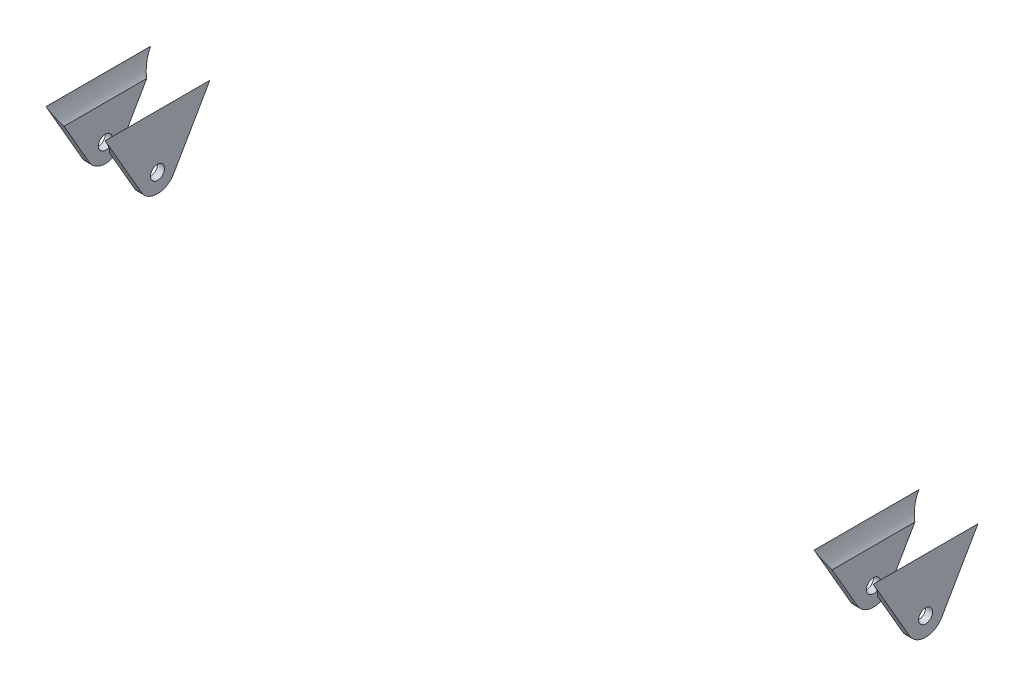
ISO-10303-21;
HEADER;
FILE_DESCRIPTION(('STEP AP214'),'2;1');
FILE_NAME('part.step','',(''),(''),'','','');
FILE_SCHEMA(('AUTOMOTIVE_DESIGN { 1 0 10303 214 1 1 1 1 }'));
ENDSEC;
DATA;
#1=APPLICATION_CONTEXT('core data for automotive mechanical design processes');
#2=APPLICATION_PROTOCOL_DEFINITION('international standard','automotive_design',2000,#1);
#3=PRODUCT_CONTEXT('',#1,'mechanical');
#4=PRODUCT('Part','Part','',(#3));
#5=PRODUCT_RELATED_PRODUCT_CATEGORY('part','',(#4));
#6=PRODUCT_DEFINITION_FORMATION('','',#4);
#7=PRODUCT_DEFINITION_CONTEXT('part definition',#1,'design');
#8=PRODUCT_DEFINITION('design','',#6,#7);
#9=PRODUCT_DEFINITION_SHAPE('','',#8);
#10=(LENGTH_UNIT() NAMED_UNIT(*) SI_UNIT(.MILLI.,.METRE.));
#11=(NAMED_UNIT(*) PLANE_ANGLE_UNIT() SI_UNIT($,.RADIAN.));
#12=(NAMED_UNIT(*) SI_UNIT($,.STERADIAN.) SOLID_ANGLE_UNIT());
#13=UNCERTAINTY_MEASURE_WITH_UNIT(LENGTH_MEASURE(1.E-05),#10,'distance_accuracy_value','');
#14=(GEOMETRIC_REPRESENTATION_CONTEXT(3) GLOBAL_UNCERTAINTY_ASSIGNED_CONTEXT((#13)) GLOBAL_UNIT_ASSIGNED_CONTEXT((#10,
#11,#12)) REPRESENTATION_CONTEXT('',''));
#15=CARTESIAN_POINT('',(0.,0.,0.));
#16=DIRECTION('',(0.,0.,1.));
#17=DIRECTION('',(1.,0.,0.));
#18=AXIS2_PLACEMENT_3D('',#15,#16,#17);
#19=CARTESIAN_POINT('',(-155.299999999999,-5.59119222334012E-13,0.));
#20=DIRECTION('',(-1.,0.,0.));
#21=DIRECTION('',(0.,1.,0.));
#22=AXIS2_PLACEMENT_3D('',#19,#20,#21);
#23=PLANE('',#22);
#24=CARTESIAN_POINT('',(-155.3,177.,222.5));
#25=DIRECTION('',(1.,0.,0.));
#26=DIRECTION('',(0.,0.,-1.));
#27=AXIS2_PLACEMENT_3D('',#24,#25,#26);
#28=CIRCLE('',#27,2.99999999999999);
#29=CARTESIAN_POINT('',(-155.3,177.,219.5));
#30=VERTEX_POINT('',#29);
#31=EDGE_CURVE('E13',#30,#30,#28,.T.);
#32=ORIENTED_EDGE('',*,*,#31,.T.);
#33=EDGE_LOOP('',(#32));
#34=FACE_BOUND('',#33,.T.);
#35=DIRECTION('',(0.,0.866256782365015,-0.499599026226644));
#36=VECTOR('',#35,1.);
#37=CARTESIAN_POINT('',(-155.3,173.003207790187,215.56994574108));
#38=LINE('',#37,#36);
#39=CARTESIAN_POINT('',(-155.3,173.003207790187,215.56994574108));
#40=VERTEX_POINT('',#39);
#41=CARTESIAN_POINT('',(-155.3,191.802439387232,204.727805176187));
#42=VERTEX_POINT('',#41);
#43=EDGE_CURVE('E135',#40,#42,#38,.T.);
#44=ORIENTED_EDGE('',*,*,#43,.F.);
#45=CARTESIAN_POINT('',(-155.3,177.,222.5));
#46=DIRECTION('',(1.,0.,0.));
#47=DIRECTION('',(0.,0.,-1.));
#48=AXIS2_PLACEMENT_3D('',#45,#46,#47);
#49=CIRCLE('',#48,7.99999999999999);
#50=CARTESIAN_POINT('',(-155.3,173.003207790187,229.43005425892));
#51=VERTEX_POINT('',#50);
#52=EDGE_CURVE('E152',#51,#40,#49,.T.);
#53=ORIENTED_EDGE('',*,*,#52,.F.);
#54=DIRECTION('',(0.,-0.866256782365014,-0.499599026226646));
#55=VECTOR('',#54,1.);
#56=CARTESIAN_POINT('',(-155.3,200.,245.));
#57=LINE('',#56,#55);
#58=CARTESIAN_POINT('',(-155.3,191.802439387233,240.272194823813));
#59=VERTEX_POINT('',#58);
#60=EDGE_CURVE('E165',#59,#51,#57,.T.);
#61=ORIENTED_EDGE('',*,*,#60,.F.);
#62=DIRECTION('',(0.,0.,1.));
#63=VECTOR('',#62,1.);
#64=CARTESIAN_POINT('',(-155.3,191.802439387233,1.18021414993795E-10));
#65=LINE('',#64,#63);
#66=EDGE_CURVE('E164',#42,#59,#65,.T.);
#67=ORIENTED_EDGE('',*,*,#66,.F.);
#68=EDGE_LOOP('',(#44,#53,#61,#67));
#69=FACE_BOUND('',#68,.T.);
#70=ADVANCED_FACE('F88',(#34,#69),#23,.T.);
#71=CARTESIAN_POINT('',(-152.299999999999,-5.59119222334012E-13,0.));
#72=DIRECTION('',(-1.,0.,0.));
#73=DIRECTION('',(0.,1.,0.));
#74=AXIS2_PLACEMENT_3D('',#71,#72,#73);
#75=PLANE('',#74);
#76=CARTESIAN_POINT('',(-152.3,177.,222.5));
#77=DIRECTION('',(1.,0.,0.));
#78=DIRECTION('',(0.,0.,-1.));
#79=AXIS2_PLACEMENT_3D('',#76,#77,#78);
#80=CIRCLE('',#79,2.99999999999999);
#81=CARTESIAN_POINT('',(-152.3,177.,219.5));
#82=VERTEX_POINT('',#81);
#83=EDGE_CURVE('E147',#82,#82,#80,.T.);
#84=ORIENTED_EDGE('',*,*,#83,.F.);
#85=EDGE_LOOP('',(#84));
#86=FACE_BOUND('',#85,.T.);
#87=DIRECTION('',(0.,0.,-1.));
#88=VECTOR('',#87,1.);
#89=CARTESIAN_POINT('',(-152.3,200.,245.));
#90=LINE('',#89,#88);
#91=CARTESIAN_POINT('',(-152.3,200.,245.));
#92=VERTEX_POINT('',#91);
#93=CARTESIAN_POINT('',(-152.3,200.,200.));
#94=VERTEX_POINT('',#93);
#95=EDGE_CURVE('E141',#92,#94,#90,.T.);
#96=ORIENTED_EDGE('',*,*,#95,.F.);
#97=DIRECTION('',(0.,-0.866256782365014,-0.499599026226646));
#98=VECTOR('',#97,1.);
#99=CARTESIAN_POINT('',(-152.3,200.,245.));
#100=LINE('',#99,#98);
#101=CARTESIAN_POINT('',(-152.3,173.003207790187,229.43005425892));
#102=VERTEX_POINT('',#101);
#103=EDGE_CURVE('E149',#92,#102,#100,.T.);
#104=ORIENTED_EDGE('',*,*,#103,.T.);
#105=CARTESIAN_POINT('',(-152.3,177.,222.5));
#106=DIRECTION('',(1.,0.,0.));
#107=DIRECTION('',(0.,0.,-1.));
#108=AXIS2_PLACEMENT_3D('',#105,#106,#107);
#109=CIRCLE('',#108,7.99999999999999);
#110=CARTESIAN_POINT('',(-152.3,173.003207790187,215.56994574108));
#111=VERTEX_POINT('',#110);
#112=EDGE_CURVE('E143',#102,#111,#109,.T.);
#113=ORIENTED_EDGE('',*,*,#112,.T.);
#114=DIRECTION('',(0.,0.866256782365015,-0.499599026226644));
#115=VECTOR('',#114,1.);
#116=CARTESIAN_POINT('',(-152.3,173.003207790187,215.56994574108));
#117=LINE('',#116,#115);
#118=EDGE_CURVE('E132',#111,#94,#117,.T.);
#119=ORIENTED_EDGE('',*,*,#118,.T.);
#120=EDGE_LOOP('',(#96,#104,#113,#119));
#121=FACE_BOUND('',#120,.T.);
#122=ADVANCED_FACE('F139',(#86,#121),#75,.F.);
#123=CARTESIAN_POINT('',(-152.3,200.,245.));
#124=DIRECTION('',(0.,-0.499599026226646,0.866256782365014));
#125=DIRECTION('',(0.,-0.866256782365014,-0.499599026226646));
#126=AXIS2_PLACEMENT_3D('',#123,#124,#125);
#127=PLANE('',#126);
#128=ORIENTED_EDGE('',*,*,#60,.T.);
#129=DIRECTION('',(-1.,0.,0.));
#130=VECTOR('',#129,1.);
#131=CARTESIAN_POINT('',(-152.3,173.003207790187,229.43005425892));
#132=LINE('',#131,#130);
#133=EDGE_CURVE('E160',#102,#51,#132,.T.);
#134=ORIENTED_EDGE('',*,*,#133,.F.);
#135=ORIENTED_EDGE('',*,*,#103,.F.);
#136=CARTESIAN_POINT('',(-165.,200.,245.));
#137=DIRECTION('',(0.,0.499599026226646,-0.866256782365014));
#138=DIRECTION('',(0.,0.866256782365014,0.499599026226646));
#139=AXIS2_PLACEMENT_3D('',#136,#137,#138);
#140=ELLIPSE('',#139,14.6607798732924,12.7);
#141=EDGE_CURVE('E106',#59,#92,#140,.F.);
#142=ORIENTED_EDGE('',*,*,#141,.F.);
#143=EDGE_LOOP('',(#128,#134,#135,#142));
#144=FACE_BOUND('',#143,.T.);
#145=ADVANCED_FACE('F189',(#144),#127,.T.);
#146=CARTESIAN_POINT('',(-152.3,177.,222.5));
#147=DIRECTION('',(-1.,0.,0.));
#148=DIRECTION('',(0.,0.,-1.));
#149=AXIS2_PLACEMENT_3D('',#146,#147,#148);
#150=CYLINDRICAL_SURFACE('',#149,7.99999999999999);
#151=ORIENTED_EDGE('',*,*,#52,.T.);
#152=DIRECTION('',(-1.,0.,0.));
#153=VECTOR('',#152,1.);
#154=CARTESIAN_POINT('',(-152.3,173.003207790187,215.56994574108));
#155=LINE('',#154,#153);
#156=EDGE_CURVE('E144',#111,#40,#155,.T.);
#157=ORIENTED_EDGE('',*,*,#156,.F.);
#158=ORIENTED_EDGE('',*,*,#112,.F.);
#159=ORIENTED_EDGE('',*,*,#133,.T.);
#160=EDGE_LOOP('',(#151,#157,#158,#159));
#161=FACE_BOUND('',#160,.T.);
#162=ADVANCED_FACE('F186',(#161),#150,.T.);
#163=CARTESIAN_POINT('',(-152.3,173.003207790187,215.56994574108));
#164=DIRECTION('',(0.,-0.499599026226644,-0.866256782365015));
#165=DIRECTION('',(0.,0.866256782365015,-0.499599026226644));
#166=AXIS2_PLACEMENT_3D('',#163,#164,#165);
#167=PLANE('',#166);
#168=ORIENTED_EDGE('',*,*,#118,.F.);
#169=ORIENTED_EDGE('',*,*,#156,.T.);
#170=ORIENTED_EDGE('',*,*,#43,.T.);
#171=CARTESIAN_POINT('',(-165.,200.,200.));
#172=DIRECTION('',(0.,0.499599026226644,0.866256782365015));
#173=DIRECTION('',(0.,-0.866256782365015,0.499599026226644));
#174=AXIS2_PLACEMENT_3D('',#171,#172,#173);
#175=ELLIPSE('',#174,14.6607798732923,12.7);
#176=EDGE_CURVE('E97',#94,#42,#175,.F.);
#177=ORIENTED_EDGE('',*,*,#176,.F.);
#178=EDGE_LOOP('',(#168,#169,#170,#177));
#179=FACE_BOUND('',#178,.T.);
#180=ADVANCED_FACE('F131',(#179),#167,.T.);
#181=CARTESIAN_POINT('',(-152.3,177.,222.5));
#182=DIRECTION('',(-1.,0.,0.));
#183=DIRECTION('',(0.,0.,-1.));
#184=AXIS2_PLACEMENT_3D('',#181,#182,#183);
#185=CYLINDRICAL_SURFACE('',#184,2.99999999999999);
#186=ORIENTED_EDGE('',*,*,#83,.T.);
#187=EDGE_LOOP('',(#186));
#188=FACE_BOUND('',#187,.T.);
#189=ORIENTED_EDGE('',*,*,#31,.F.);
#190=EDGE_LOOP('',(#189));
#191=FACE_BOUND('',#190,.T.);
#192=ADVANCED_FACE('F200',(#188,#191),#185,.F.);
#193=CARTESIAN_POINT('',(-165.,200.,1.18016707517654E-10));
#194=DIRECTION('',(0.,0.,1.));
#195=DIRECTION('',(0.,-1.,0.));
#196=AXIS2_PLACEMENT_3D('',#193,#194,#195);
#197=CYLINDRICAL_SURFACE('',#196,12.7);
#198=ORIENTED_EDGE('',*,*,#66,.T.);
#199=ORIENTED_EDGE('',*,*,#141,.T.);
#200=ORIENTED_EDGE('',*,*,#95,.T.);
#201=ORIENTED_EDGE('',*,*,#176,.T.);
#202=EDGE_LOOP('',(#198,#199,#200,#201));
#203=FACE_BOUND('',#202,.T.);
#204=ADVANCED_FACE('F146',(#203),#197,.F.);
#205=CLOSED_SHELL('',(#70,#122,#145,#162,#180,#192,#204));
#206=MANIFOLD_SOLID_BREP('B2',#205);
#207=CARTESIAN_POINT('',(-174.700000000001,-5.59119222334012E-13,0.));
#208=DIRECTION('',(1.,0.,0.));
#209=DIRECTION('',(0.,1.,0.));
#210=AXIS2_PLACEMENT_3D('',#207,#208,#209);
#211=PLANE('',#210);
#212=CARTESIAN_POINT('',(-174.7,177.,222.5));
#213=DIRECTION('',(1.,0.,0.));
#214=DIRECTION('',(0.,0.,-1.));
#215=AXIS2_PLACEMENT_3D('',#212,#213,#214);
#216=CIRCLE('',#215,2.99999999999999);
#217=CARTESIAN_POINT('',(-174.7,177.,219.5));
#218=VERTEX_POINT('',#217);
#219=EDGE_CURVE('E324',#218,#218,#216,.T.);
#220=ORIENTED_EDGE('',*,*,#219,.F.);
#221=EDGE_LOOP('',(#220));
#222=FACE_BOUND('',#221,.T.);
#223=DIRECTION('',(0.,-0.866256782365014,-0.499599026226646));
#224=VECTOR('',#223,1.);
#225=CARTESIAN_POINT('',(-174.7,200.,245.));
#226=LINE('',#225,#224);
#227=CARTESIAN_POINT('',(-174.7,191.802439387233,240.272194823813));
#228=VERTEX_POINT('',#227);
#229=CARTESIAN_POINT('',(-174.7,173.003207790187,229.43005425892));
#230=VERTEX_POINT('',#229);
#231=EDGE_CURVE('E343',#228,#230,#226,.T.);
#232=ORIENTED_EDGE('',*,*,#231,.T.);
#233=CARTESIAN_POINT('',(-174.7,177.,222.5));
#234=DIRECTION('',(1.,0.,0.));
#235=DIRECTION('',(0.,0.,-1.));
#236=AXIS2_PLACEMENT_3D('',#233,#234,#235);
#237=CIRCLE('',#236,7.99999999999999);
#238=CARTESIAN_POINT('',(-174.7,173.003207790187,215.56994574108));
#239=VERTEX_POINT('',#238);
#240=EDGE_CURVE('E327',#230,#239,#237,.T.);
#241=ORIENTED_EDGE('',*,*,#240,.T.);
#242=DIRECTION('',(0.,0.866256782365015,-0.499599026226644));
#243=VECTOR('',#242,1.);
#244=CARTESIAN_POINT('',(-174.7,173.003207790187,215.56994574108));
#245=LINE('',#244,#243);
#246=CARTESIAN_POINT('',(-174.7,191.802439387232,204.727805176187));
#247=VERTEX_POINT('',#246);
#248=EDGE_CURVE('E312',#239,#247,#245,.T.);
#249=ORIENTED_EDGE('',*,*,#248,.T.);
#250=DIRECTION('',(0.,0.,1.));
#251=VECTOR('',#250,1.);
#252=CARTESIAN_POINT('',(-174.7,191.802439387233,1.18021414993795E-10));
#253=LINE('',#252,#251);
#254=EDGE_CURVE('E319',#228,#247,#253,.F.);
#255=ORIENTED_EDGE('',*,*,#254,.F.);
#256=EDGE_LOOP('',(#232,#241,#249,#255));
#257=FACE_BOUND('',#256,.T.);
#258=ADVANCED_FACE('F267',(#222,#257),#211,.T.);
#259=CARTESIAN_POINT('',(-177.700000000001,-5.59119222334012E-13,0.));
#260=DIRECTION('',(1.,0.,0.));
#261=DIRECTION('',(0.,1.,0.));
#262=AXIS2_PLACEMENT_3D('',#259,#260,#261);
#263=PLANE('',#262);
#264=CARTESIAN_POINT('',(-177.7,177.,222.5));
#265=DIRECTION('',(1.,0.,0.));
#266=DIRECTION('',(0.,0.,-1.));
#267=AXIS2_PLACEMENT_3D('',#264,#265,#266);
#268=CIRCLE('',#267,2.99999999999999);
#269=CARTESIAN_POINT('',(-177.7,177.,219.5));
#270=VERTEX_POINT('',#269);
#271=EDGE_CURVE('E276',#270,#270,#268,.T.);
#272=ORIENTED_EDGE('',*,*,#271,.T.);
#273=EDGE_LOOP('',(#272));
#274=FACE_BOUND('',#273,.T.);
#275=DIRECTION('',(0.,0.,-1.));
#276=VECTOR('',#275,1.);
#277=CARTESIAN_POINT('',(-177.7,200.,245.));
#278=LINE('',#277,#276);
#279=CARTESIAN_POINT('',(-177.7,200.,245.));
#280=VERTEX_POINT('',#279);
#281=CARTESIAN_POINT('',(-177.7,200.,200.));
#282=VERTEX_POINT('',#281);
#283=EDGE_CURVE('E86',#280,#282,#278,.T.);
#284=ORIENTED_EDGE('',*,*,#283,.T.);
#285=DIRECTION('',(0.,0.866256782365015,-0.499599026226644));
#286=VECTOR('',#285,1.);
#287=CARTESIAN_POINT('',(-177.7,173.003207790187,215.56994574108));
#288=LINE('',#287,#286);
#289=CARTESIAN_POINT('',(-177.7,173.003207790187,215.56994574108));
#290=VERTEX_POINT('',#289);
#291=EDGE_CURVE('E315',#290,#282,#288,.T.);
#292=ORIENTED_EDGE('',*,*,#291,.F.);
#293=CARTESIAN_POINT('',(-177.7,177.,222.5));
#294=DIRECTION('',(1.,0.,0.));
#295=DIRECTION('',(0.,0.,-1.));
#296=AXIS2_PLACEMENT_3D('',#293,#294,#295);
#297=CIRCLE('',#296,7.99999999999999);
#298=CARTESIAN_POINT('',(-177.7,173.003207790187,229.43005425892));
#299=VERTEX_POINT('',#298);
#300=EDGE_CURVE('E339',#299,#290,#297,.T.);
#301=ORIENTED_EDGE('',*,*,#300,.F.);
#302=DIRECTION('',(0.,-0.866256782365014,-0.499599026226646));
#303=VECTOR('',#302,1.);
#304=CARTESIAN_POINT('',(-177.7,200.,245.));
#305=LINE('',#304,#303);
#306=EDGE_CURVE('E323',#280,#299,#305,.T.);
#307=ORIENTED_EDGE('',*,*,#306,.F.);
#308=EDGE_LOOP('',(#284,#292,#301,#307));
#309=FACE_BOUND('',#308,.T.);
#310=ADVANCED_FACE('F369',(#274,#309),#263,.F.);
#311=CARTESIAN_POINT('',(-177.7,200.,245.));
#312=DIRECTION('',(0.,-0.499599026226646,0.866256782365014));
#313=DIRECTION('',(0.,-0.866256782365014,-0.499599026226646));
#314=AXIS2_PLACEMENT_3D('',#311,#312,#313);
#315=PLANE('',#314);
#316=ORIENTED_EDGE('',*,*,#306,.T.);
#317=DIRECTION('',(1.,0.,0.));
#318=VECTOR('',#317,1.);
#319=CARTESIAN_POINT('',(-177.7,173.003207790187,229.43005425892));
#320=LINE('',#319,#318);
#321=EDGE_CURVE('E328',#299,#230,#320,.T.);
#322=ORIENTED_EDGE('',*,*,#321,.T.);
#323=ORIENTED_EDGE('',*,*,#231,.F.);
#324=CARTESIAN_POINT('',(-165.,200.,245.));
#325=DIRECTION('',(0.,0.499599026226646,-0.866256782365014));
#326=DIRECTION('',(0.,0.866256782365014,0.499599026226646));
#327=AXIS2_PLACEMENT_3D('',#324,#325,#326);
#328=ELLIPSE('',#327,14.6607798732924,12.7);
#329=EDGE_CURVE('E284',#280,#228,#328,.F.);
#330=ORIENTED_EDGE('',*,*,#329,.F.);
#331=EDGE_LOOP('',(#316,#322,#323,#330));
#332=FACE_BOUND('',#331,.T.);
#333=ADVANCED_FACE('F364',(#332),#315,.T.);
#334=CARTESIAN_POINT('',(-177.7,177.,222.5));
#335=DIRECTION('',(1.,0.,0.));
#336=DIRECTION('',(0.,0.,-1.));
#337=AXIS2_PLACEMENT_3D('',#334,#335,#336);
#338=CYLINDRICAL_SURFACE('',#337,7.99999999999999);
#339=ORIENTED_EDGE('',*,*,#240,.F.);
#340=ORIENTED_EDGE('',*,*,#321,.F.);
#341=ORIENTED_EDGE('',*,*,#300,.T.);
#342=DIRECTION('',(1.,0.,0.));
#343=VECTOR('',#342,1.);
#344=CARTESIAN_POINT('',(-177.7,173.003207790187,215.56994574108));
#345=LINE('',#344,#343);
#346=EDGE_CURVE('E316',#290,#239,#345,.T.);
#347=ORIENTED_EDGE('',*,*,#346,.T.);
#348=EDGE_LOOP('',(#339,#340,#341,#347));
#349=FACE_BOUND('',#348,.T.);
#350=ADVANCED_FACE('F367',(#349),#338,.T.);
#351=CARTESIAN_POINT('',(-177.7,173.003207790187,215.56994574108));
#352=DIRECTION('',(0.,-0.499599026226644,-0.866256782365015));
#353=DIRECTION('',(0.,0.866256782365015,-0.499599026226644));
#354=AXIS2_PLACEMENT_3D('',#351,#352,#353);
#355=PLANE('',#354);
#356=ORIENTED_EDGE('',*,*,#248,.F.);
#357=ORIENTED_EDGE('',*,*,#346,.F.);
#358=ORIENTED_EDGE('',*,*,#291,.T.);
#359=CARTESIAN_POINT('',(-165.,200.,200.));
#360=DIRECTION('',(0.,0.499599026226644,0.866256782365015));
#361=DIRECTION('',(0.,-0.866256782365015,0.499599026226644));
#362=AXIS2_PLACEMENT_3D('',#359,#360,#361);
#363=ELLIPSE('',#362,14.6607798732923,12.7);
#364=EDGE_CURVE('E306',#247,#282,#363,.F.);
#365=ORIENTED_EDGE('',*,*,#364,.F.);
#366=EDGE_LOOP('',(#356,#357,#358,#365));
#367=FACE_BOUND('',#366,.T.);
#368=ADVANCED_FACE('F310',(#367),#355,.T.);
#369=CARTESIAN_POINT('',(-177.7,177.,222.5));
#370=DIRECTION('',(1.,0.,0.));
#371=DIRECTION('',(0.,0.,-1.));
#372=AXIS2_PLACEMENT_3D('',#369,#370,#371);
#373=CYLINDRICAL_SURFACE('',#372,2.99999999999999);
#374=ORIENTED_EDGE('',*,*,#271,.F.);
#375=EDGE_LOOP('',(#374));
#376=FACE_BOUND('',#375,.T.);
#377=ORIENTED_EDGE('',*,*,#219,.T.);
#378=EDGE_LOOP('',(#377));
#379=FACE_BOUND('',#378,.T.);
#380=ADVANCED_FACE('F381',(#376,#379),#373,.F.);
#381=CARTESIAN_POINT('',(-165.,200.,1.18016707517654E-10));
#382=DIRECTION('',(0.,0.,1.));
#383=DIRECTION('',(0.,-1.,0.));
#384=AXIS2_PLACEMENT_3D('',#381,#382,#383);
#385=CYLINDRICAL_SURFACE('',#384,12.7);
#386=ORIENTED_EDGE('',*,*,#283,.F.);
#387=ORIENTED_EDGE('',*,*,#329,.T.);
#388=ORIENTED_EDGE('',*,*,#254,.T.);
#389=ORIENTED_EDGE('',*,*,#364,.T.);
#390=EDGE_LOOP('',(#386,#387,#388,#389));
#391=FACE_BOUND('',#390,.T.);
#392=ADVANCED_FACE('F320',(#391),#385,.F.);
#393=CLOSED_SHELL('',(#258,#310,#333,#350,#368,#380,#392));
#394=MANIFOLD_SOLID_BREP('B7',#393);
#395=CARTESIAN_POINT('',(155.299999999999,-5.59119222334012E-13,0.));
#396=DIRECTION('',(1.,0.,0.));
#397=DIRECTION('',(0.,1.,0.));
#398=AXIS2_PLACEMENT_3D('',#395,#396,#397);
#399=PLANE('',#398);
#400=CARTESIAN_POINT('',(155.3,177.,222.5));
#401=DIRECTION('',(1.,0.,0.));
#402=DIRECTION('',(0.,0.,-1.));
#403=AXIS2_PLACEMENT_3D('',#400,#401,#402);
#404=CIRCLE('',#403,2.99999999999999);
#405=CARTESIAN_POINT('',(155.3,177.,219.5));
#406=VERTEX_POINT('',#405);
#407=EDGE_CURVE('E265',#406,#406,#404,.T.);
#408=ORIENTED_EDGE('',*,*,#407,.F.);
#409=EDGE_LOOP('',(#408));
#410=FACE_BOUND('',#409,.T.);
#411=DIRECTION('',(0.,0.866256782365015,-0.499599026226644));
#412=VECTOR('',#411,1.);
#413=CARTESIAN_POINT('',(155.3,173.003207790187,215.56994574108));
#414=LINE('',#413,#412);
#415=CARTESIAN_POINT('',(155.3,173.003207790187,215.56994574108));
#416=VERTEX_POINT('',#415);
#417=CARTESIAN_POINT('',(155.3,191.802439387232,204.727805176187));
#418=VERTEX_POINT('',#417);
#419=EDGE_CURVE('E518',#416,#418,#414,.T.);
#420=ORIENTED_EDGE('',*,*,#419,.T.);
#421=DIRECTION('',(0.,0.,1.));
#422=VECTOR('',#421,1.);
#423=CARTESIAN_POINT('',(155.3,191.802439387233,1.18021414993795E-10));
#424=LINE('',#423,#422);
#425=CARTESIAN_POINT('',(155.3,191.802439387233,240.272194823813));
#426=VERTEX_POINT('',#425);
#427=EDGE_CURVE('E480',#418,#426,#424,.T.);
#428=ORIENTED_EDGE('',*,*,#427,.T.);
#429=DIRECTION('',(0.,-0.866256782365014,-0.499599026226646));
#430=VECTOR('',#429,1.);
#431=CARTESIAN_POINT('',(155.3,200.,245.));
#432=LINE('',#431,#430);
#433=CARTESIAN_POINT('',(155.3,173.003207790187,229.43005425892));
#434=VERTEX_POINT('',#433);
#435=EDGE_CURVE('E517',#426,#434,#432,.T.);
#436=ORIENTED_EDGE('',*,*,#435,.T.);
#437=CARTESIAN_POINT('',(155.3,177.,222.5));
#438=DIRECTION('',(1.,0.,0.));
#439=DIRECTION('',(0.,0.,-1.));
#440=AXIS2_PLACEMENT_3D('',#437,#438,#439);
#441=CIRCLE('',#440,7.99999999999999);
#442=EDGE_CURVE('E505',#434,#416,#441,.T.);
#443=ORIENTED_EDGE('',*,*,#442,.T.);
#444=EDGE_LOOP('',(#420,#428,#436,#443));
#445=FACE_BOUND('',#444,.T.);
#446=ADVANCED_FACE('F445',(#410,#445),#399,.T.);
#447=CARTESIAN_POINT('',(152.299999999999,-5.59119222334012E-13,0.));
#448=DIRECTION('',(1.,0.,0.));
#449=DIRECTION('',(0.,1.,0.));
#450=AXIS2_PLACEMENT_3D('',#447,#448,#449);
#451=PLANE('',#450);
#452=CARTESIAN_POINT('',(152.3,177.,222.5));
#453=DIRECTION('',(1.,0.,0.));
#454=DIRECTION('',(0.,0.,-1.));
#455=AXIS2_PLACEMENT_3D('',#452,#453,#454);
#456=CIRCLE('',#455,2.99999999999999);
#457=CARTESIAN_POINT('',(152.3,177.,219.5));
#458=VERTEX_POINT('',#457);
#459=EDGE_CURVE('E501',#458,#458,#456,.T.);
#460=ORIENTED_EDGE('',*,*,#459,.T.);
#461=EDGE_LOOP('',(#460));
#462=FACE_BOUND('',#461,.T.);
#463=DIRECTION('',(0.,0.,-1.));
#464=VECTOR('',#463,1.);
#465=CARTESIAN_POINT('',(152.3,200.,245.));
#466=LINE('',#465,#464);
#467=CARTESIAN_POINT('',(152.3,200.,245.));
#468=VERTEX_POINT('',#467);
#469=CARTESIAN_POINT('',(152.3,200.,200.));
#470=VERTEX_POINT('',#469);
#471=EDGE_CURVE('E485',#468,#470,#466,.T.);
#472=ORIENTED_EDGE('',*,*,#471,.T.);
#473=DIRECTION('',(0.,0.866256782365015,-0.499599026226644));
#474=VECTOR('',#473,1.);
#475=CARTESIAN_POINT('',(152.3,173.003207790187,215.56994574108));
#476=LINE('',#475,#474);
#477=CARTESIAN_POINT('',(152.3,173.003207790187,215.56994574108));
#478=VERTEX_POINT('',#477);
#479=EDGE_CURVE('E488',#478,#470,#476,.T.);
#480=ORIENTED_EDGE('',*,*,#479,.F.);
#481=CARTESIAN_POINT('',(152.3,177.,222.5));
#482=DIRECTION('',(1.,0.,0.));
#483=DIRECTION('',(0.,0.,-1.));
#484=AXIS2_PLACEMENT_3D('',#481,#482,#483);
#485=CIRCLE('',#484,7.99999999999999);
#486=CARTESIAN_POINT('',(152.3,173.003207790187,229.43005425892));
#487=VERTEX_POINT('',#486);
#488=EDGE_CURVE('E528',#487,#478,#485,.T.);
#489=ORIENTED_EDGE('',*,*,#488,.F.);
#490=DIRECTION('',(0.,-0.866256782365014,-0.499599026226646));
#491=VECTOR('',#490,1.);
#492=CARTESIAN_POINT('',(152.3,200.,245.));
#493=LINE('',#492,#491);
#494=EDGE_CURVE('E500',#468,#487,#493,.T.);
#495=ORIENTED_EDGE('',*,*,#494,.F.);
#496=EDGE_LOOP('',(#472,#480,#489,#495));
#497=FACE_BOUND('',#496,.T.);
#498=ADVANCED_FACE('F499',(#462,#497),#451,.F.);
#499=CARTESIAN_POINT('',(152.3,200.,245.));
#500=DIRECTION('',(0.,-0.499599026226646,0.866256782365014));
#501=DIRECTION('',(0.,-0.866256782365014,-0.499599026226646));
#502=AXIS2_PLACEMENT_3D('',#499,#500,#501);
#503=PLANE('',#502);
#504=ORIENTED_EDGE('',*,*,#435,.F.);
#505=CARTESIAN_POINT('',(165.,200.,245.));
#506=DIRECTION('',(0.,-0.499599026226646,0.866256782365014));
#507=DIRECTION('',(0.,0.866256782365014,0.499599026226646));
#508=AXIS2_PLACEMENT_3D('',#505,#506,#507);
#509=ELLIPSE('',#508,14.6607798732924,12.7);
#510=EDGE_CURVE('E463',#426,#468,#509,.F.);
#511=ORIENTED_EDGE('',*,*,#510,.T.);
#512=ORIENTED_EDGE('',*,*,#494,.T.);
#513=DIRECTION('',(1.,0.,0.));
#514=VECTOR('',#513,1.);
#515=CARTESIAN_POINT('',(152.3,173.003207790187,229.43005425892));
#516=LINE('',#515,#514);
#517=EDGE_CURVE('E513',#487,#434,#516,.T.);
#518=ORIENTED_EDGE('',*,*,#517,.T.);
#519=EDGE_LOOP('',(#504,#511,#512,#518));
#520=FACE_BOUND('',#519,.T.);
#521=ADVANCED_FACE('F546',(#520),#503,.T.);
#522=CARTESIAN_POINT('',(152.3,177.,222.5));
#523=DIRECTION('',(1.,0.,0.));
#524=DIRECTION('',(0.,0.,-1.));
#525=AXIS2_PLACEMENT_3D('',#522,#523,#524);
#526=CYLINDRICAL_SURFACE('',#525,7.99999999999999);
#527=ORIENTED_EDGE('',*,*,#442,.F.);
#528=ORIENTED_EDGE('',*,*,#517,.F.);
#529=ORIENTED_EDGE('',*,*,#488,.T.);
#530=DIRECTION('',(1.,0.,0.));
#531=VECTOR('',#530,1.);
#532=CARTESIAN_POINT('',(152.3,173.003207790187,215.56994574108));
#533=LINE('',#532,#531);
#534=EDGE_CURVE('E494',#478,#416,#533,.T.);
#535=ORIENTED_EDGE('',*,*,#534,.T.);
#536=EDGE_LOOP('',(#527,#528,#529,#535));
#537=FACE_BOUND('',#536,.T.);
#538=ADVANCED_FACE('F543',(#537),#526,.T.);
#539=CARTESIAN_POINT('',(152.3,173.003207790187,215.56994574108));
#540=DIRECTION('',(0.,-0.499599026226644,-0.866256782365015));
#541=DIRECTION('',(0.,0.866256782365015,-0.499599026226644));
#542=AXIS2_PLACEMENT_3D('',#539,#540,#541);
#543=PLANE('',#542);
#544=ORIENTED_EDGE('',*,*,#479,.T.);
#545=CARTESIAN_POINT('',(165.,200.,200.));
#546=DIRECTION('',(0.,-0.499599026226644,-0.866256782365015));
#547=DIRECTION('',(0.,-0.866256782365015,0.499599026226644));
#548=AXIS2_PLACEMENT_3D('',#545,#546,#547);
#549=ELLIPSE('',#548,14.6607798732923,12.7);
#550=EDGE_CURVE('E454',#470,#418,#549,.F.);
#551=ORIENTED_EDGE('',*,*,#550,.T.);
#552=ORIENTED_EDGE('',*,*,#419,.F.);
#553=ORIENTED_EDGE('',*,*,#534,.F.);
#554=EDGE_LOOP('',(#544,#551,#552,#553));
#555=FACE_BOUND('',#554,.T.);
#556=ADVANCED_FACE('F492',(#555),#543,.T.);
#557=CARTESIAN_POINT('',(152.3,177.,222.5));
#558=DIRECTION('',(1.,0.,0.));
#559=DIRECTION('',(0.,0.,-1.));
#560=AXIS2_PLACEMENT_3D('',#557,#558,#559);
#561=CYLINDRICAL_SURFACE('',#560,2.99999999999999);
#562=ORIENTED_EDGE('',*,*,#459,.F.);
#563=EDGE_LOOP('',(#562));
#564=FACE_BOUND('',#563,.T.);
#565=ORIENTED_EDGE('',*,*,#407,.T.);
#566=EDGE_LOOP('',(#565));
#567=FACE_BOUND('',#566,.T.);
#568=ADVANCED_FACE('F555',(#564,#567),#561,.F.);
#569=CARTESIAN_POINT('',(165.,200.,1.18016707517654E-10));
#570=DIRECTION('',(0.,0.,1.));
#571=DIRECTION('',(0.,-1.,0.));
#572=AXIS2_PLACEMENT_3D('',#569,#570,#571);
#573=CYLINDRICAL_SURFACE('',#572,12.7);
#574=ORIENTED_EDGE('',*,*,#427,.F.);
#575=ORIENTED_EDGE('',*,*,#550,.F.);
#576=ORIENTED_EDGE('',*,*,#471,.F.);
#577=ORIENTED_EDGE('',*,*,#510,.F.);
#578=EDGE_LOOP('',(#574,#575,#576,#577));
#579=FACE_BOUND('',#578,.T.);
#580=ADVANCED_FACE('F483',(#579),#573,.F.);
#581=CLOSED_SHELL('',(#446,#498,#521,#538,#556,#568,#580));
#582=MANIFOLD_SOLID_BREP('B80',#581);
#583=CARTESIAN_POINT('',(174.700000000001,-5.59119222334012E-13,0.));
#584=DIRECTION('',(-1.,0.,0.));
#585=DIRECTION('',(0.,1.,0.));
#586=AXIS2_PLACEMENT_3D('',#583,#584,#585);
#587=PLANE('',#586);
#588=CARTESIAN_POINT('',(174.7,177.,222.5));
#589=DIRECTION('',(1.,0.,0.));
#590=DIRECTION('',(0.,0.,-1.));
#591=AXIS2_PLACEMENT_3D('',#588,#589,#590);
#592=CIRCLE('',#591,2.99999999999999);
#593=CARTESIAN_POINT('',(174.7,177.,219.5));
#594=VERTEX_POINT('',#593);
#595=EDGE_CURVE('E667',#594,#594,#592,.T.);
#596=ORIENTED_EDGE('',*,*,#595,.T.);
#597=EDGE_LOOP('',(#596));
#598=FACE_BOUND('',#597,.T.);
#599=DIRECTION('',(0.,-0.866256782365014,-0.499599026226646));
#600=VECTOR('',#599,1.);
#601=CARTESIAN_POINT('',(174.7,200.,245.));
#602=LINE('',#601,#600);
#603=CARTESIAN_POINT('',(174.7,191.802439387233,240.272194823813));
#604=VERTEX_POINT('',#603);
#605=CARTESIAN_POINT('',(174.7,173.003207790187,229.43005425892));
#606=VERTEX_POINT('',#605);
#607=EDGE_CURVE('E665',#604,#606,#602,.T.);
#608=ORIENTED_EDGE('',*,*,#607,.F.);
#609=DIRECTION('',(0.,0.,1.));
#610=VECTOR('',#609,1.);
#611=CARTESIAN_POINT('',(174.7,191.802439387233,1.18021414993795E-10));
#612=LINE('',#611,#610);
#613=CARTESIAN_POINT('',(174.7,191.802439387232,204.727805176187));
#614=VERTEX_POINT('',#613);
#615=EDGE_CURVE('E653',#604,#614,#612,.F.);
#616=ORIENTED_EDGE('',*,*,#615,.T.);
#617=DIRECTION('',(0.,0.866256782365015,-0.499599026226644));
#618=VECTOR('',#617,1.);
#619=CARTESIAN_POINT('',(174.7,173.003207790187,215.56994574108));
#620=LINE('',#619,#618);
#621=CARTESIAN_POINT('',(174.7,173.003207790187,215.56994574108));
#622=VERTEX_POINT('',#621);
#623=EDGE_CURVE('E659',#622,#614,#620,.T.);
#624=ORIENTED_EDGE('',*,*,#623,.F.);
#625=CARTESIAN_POINT('',(174.7,177.,222.5));
#626=DIRECTION('',(1.,0.,0.));
#627=DIRECTION('',(0.,0.,-1.));
#628=AXIS2_PLACEMENT_3D('',#625,#626,#627);
#629=CIRCLE('',#628,7.99999999999999);
#630=EDGE_CURVE('E674',#606,#622,#629,.T.);
#631=ORIENTED_EDGE('',*,*,#630,.F.);
#632=EDGE_LOOP('',(#608,#616,#624,#631));
#633=FACE_BOUND('',#632,.T.);
#634=ADVANCED_FACE('F614',(#598,#633),#587,.T.);
#635=CARTESIAN_POINT('',(177.700000000001,-5.59119222334012E-13,0.));
#636=DIRECTION('',(-1.,0.,0.));
#637=DIRECTION('',(0.,1.,0.));
#638=AXIS2_PLACEMENT_3D('',#635,#636,#637);
#639=PLANE('',#638);
#640=CARTESIAN_POINT('',(177.7,177.,222.5));
#641=DIRECTION('',(1.,0.,0.));
#642=DIRECTION('',(0.,0.,-1.));
#643=AXIS2_PLACEMENT_3D('',#640,#641,#642);
#644=CIRCLE('',#643,2.99999999999999);
#645=CARTESIAN_POINT('',(177.7,177.,219.5));
#646=VERTEX_POINT('',#645);
#647=EDGE_CURVE('E623',#646,#646,#644,.T.);
#648=ORIENTED_EDGE('',*,*,#647,.F.);
#649=EDGE_LOOP('',(#648));
#650=FACE_BOUND('',#649,.T.);
#651=DIRECTION('',(0.,0.,-1.));
#652=VECTOR('',#651,1.);
#653=CARTESIAN_POINT('',(177.7,200.,245.));
#654=LINE('',#653,#652);
#655=CARTESIAN_POINT('',(177.7,200.,245.));
#656=VERTEX_POINT('',#655);
#657=CARTESIAN_POINT('',(177.7,200.,200.));
#658=VERTEX_POINT('',#657);
#659=EDGE_CURVE('E443',#656,#658,#654,.T.);
#660=ORIENTED_EDGE('',*,*,#659,.F.);
#661=DIRECTION('',(0.,-0.866256782365014,-0.499599026226646));
#662=VECTOR('',#661,1.);
#663=CARTESIAN_POINT('',(177.7,200.,245.));
#664=LINE('',#663,#662);
#665=CARTESIAN_POINT('',(177.7,173.003207790187,229.43005425892));
#666=VERTEX_POINT('',#665);
#667=EDGE_CURVE('E666',#656,#666,#664,.T.);
#668=ORIENTED_EDGE('',*,*,#667,.T.);
#669=CARTESIAN_POINT('',(177.7,177.,222.5));
#670=DIRECTION('',(1.,0.,0.));
#671=DIRECTION('',(0.,0.,-1.));
#672=AXIS2_PLACEMENT_3D('',#669,#670,#671);
#673=CIRCLE('',#672,7.99999999999999);
#674=CARTESIAN_POINT('',(177.7,173.003207790187,215.56994574108));
#675=VERTEX_POINT('',#674);
#676=EDGE_CURVE('E685',#666,#675,#673,.T.);
#677=ORIENTED_EDGE('',*,*,#676,.T.);
#678=DIRECTION('',(0.,0.866256782365015,-0.499599026226644));
#679=VECTOR('',#678,1.);
#680=CARTESIAN_POINT('',(177.7,173.003207790187,215.56994574108));
#681=LINE('',#680,#679);
#682=EDGE_CURVE('E683',#675,#658,#681,.T.);
#683=ORIENTED_EDGE('',*,*,#682,.T.);
#684=EDGE_LOOP('',(#660,#668,#677,#683));
#685=FACE_BOUND('',#684,.T.);
#686=ADVANCED_FACE('F716',(#650,#685),#639,.F.);
#687=CARTESIAN_POINT('',(177.7,200.,245.));
#688=DIRECTION('',(0.,-0.499599026226646,0.866256782365014));
#689=DIRECTION('',(0.,-0.866256782365014,-0.499599026226646));
#690=AXIS2_PLACEMENT_3D('',#687,#688,#689);
#691=PLANE('',#690);
#692=ORIENTED_EDGE('',*,*,#667,.F.);
#693=CARTESIAN_POINT('',(165.,200.,245.));
#694=DIRECTION('',(0.,-0.499599026226646,0.866256782365014));
#695=DIRECTION('',(0.,0.866256782365014,0.499599026226646));
#696=AXIS2_PLACEMENT_3D('',#693,#694,#695);
#697=ELLIPSE('',#696,14.6607798732924,12.7);
#698=EDGE_CURVE('E630',#656,#604,#697,.F.);
#699=ORIENTED_EDGE('',*,*,#698,.T.);
#700=ORIENTED_EDGE('',*,*,#607,.T.);
#701=DIRECTION('',(-1.,0.,0.));
#702=VECTOR('',#701,1.);
#703=CARTESIAN_POINT('',(177.7,173.003207790187,229.43005425892));
#704=LINE('',#703,#702);
#705=EDGE_CURVE('E671',#666,#606,#704,.T.);
#706=ORIENTED_EDGE('',*,*,#705,.F.);
#707=EDGE_LOOP('',(#692,#699,#700,#706));
#708=FACE_BOUND('',#707,.T.);
#709=ADVANCED_FACE('F711',(#708),#691,.T.);
#710=CARTESIAN_POINT('',(177.7,177.,222.5));
#711=DIRECTION('',(-1.,0.,0.));
#712=DIRECTION('',(0.,0.,-1.));
#713=AXIS2_PLACEMENT_3D('',#710,#711,#712);
#714=CYLINDRICAL_SURFACE('',#713,7.99999999999999);
#715=ORIENTED_EDGE('',*,*,#630,.T.);
#716=DIRECTION('',(-1.,0.,0.));
#717=VECTOR('',#716,1.);
#718=CARTESIAN_POINT('',(177.7,173.003207790187,215.56994574108));
#719=LINE('',#718,#717);
#720=EDGE_CURVE('E658',#675,#622,#719,.T.);
#721=ORIENTED_EDGE('',*,*,#720,.F.);
#722=ORIENTED_EDGE('',*,*,#676,.F.);
#723=ORIENTED_EDGE('',*,*,#705,.T.);
#724=EDGE_LOOP('',(#715,#721,#722,#723));
#725=FACE_BOUND('',#724,.T.);
#726=ADVANCED_FACE('F714',(#725),#714,.T.);
#727=CARTESIAN_POINT('',(177.7,173.003207790187,215.56994574108));
#728=DIRECTION('',(0.,-0.499599026226644,-0.866256782365015));
#729=DIRECTION('',(0.,0.866256782365015,-0.499599026226644));
#730=AXIS2_PLACEMENT_3D('',#727,#728,#729);
#731=PLANE('',#730);
#732=ORIENTED_EDGE('',*,*,#623,.T.);
#733=CARTESIAN_POINT('',(165.,200.,200.));
#734=DIRECTION('',(0.,-0.499599026226644,-0.866256782365015));
#735=DIRECTION('',(0.,-0.866256782365015,0.499599026226644));
#736=AXIS2_PLACEMENT_3D('',#733,#734,#735);
#737=ELLIPSE('',#736,14.6607798732923,12.7);
#738=EDGE_CURVE('E650',#614,#658,#737,.F.);
#739=ORIENTED_EDGE('',*,*,#738,.T.);
#740=ORIENTED_EDGE('',*,*,#682,.F.);
#741=ORIENTED_EDGE('',*,*,#720,.T.);
#742=EDGE_LOOP('',(#732,#739,#740,#741));
#743=FACE_BOUND('',#742,.T.);
#744=ADVANCED_FACE('F669',(#743),#731,.T.);
#745=CARTESIAN_POINT('',(177.7,177.,222.5));
#746=DIRECTION('',(-1.,0.,0.));
#747=DIRECTION('',(0.,0.,-1.));
#748=AXIS2_PLACEMENT_3D('',#745,#746,#747);
#749=CYLINDRICAL_SURFACE('',#748,2.99999999999999);
#750=ORIENTED_EDGE('',*,*,#647,.T.);
#751=EDGE_LOOP('',(#750));
#752=FACE_BOUND('',#751,.T.);
#753=ORIENTED_EDGE('',*,*,#595,.F.);
#754=EDGE_LOOP('',(#753));
#755=FACE_BOUND('',#754,.T.);
#756=ADVANCED_FACE('F729',(#752,#755),#749,.F.);
#757=CARTESIAN_POINT('',(165.,200.,1.18016707517654E-10));
#758=DIRECTION('',(0.,0.,1.));
#759=DIRECTION('',(0.,-1.,0.));
#760=AXIS2_PLACEMENT_3D('',#757,#758,#759);
#761=CYLINDRICAL_SURFACE('',#760,12.7);
#762=ORIENTED_EDGE('',*,*,#659,.T.);
#763=ORIENTED_EDGE('',*,*,#738,.F.);
#764=ORIENTED_EDGE('',*,*,#615,.F.);
#765=ORIENTED_EDGE('',*,*,#698,.F.);
#766=EDGE_LOOP('',(#762,#763,#764,#765));
#767=FACE_BOUND('',#766,.T.);
#768=ADVANCED_FACE('F652',(#767),#761,.F.);
#769=CLOSED_SHELL('',(#634,#686,#709,#726,#744,#756,#768));
#770=MANIFOLD_SOLID_BREP('B259',#769);
#771=ADVANCED_BREP_SHAPE_REPRESENTATION('',(#18,#206,#394,#582,#770),#14);
#772=SHAPE_DEFINITION_REPRESENTATION(#9,#771);
ENDSEC;
END-ISO-10303-21;
